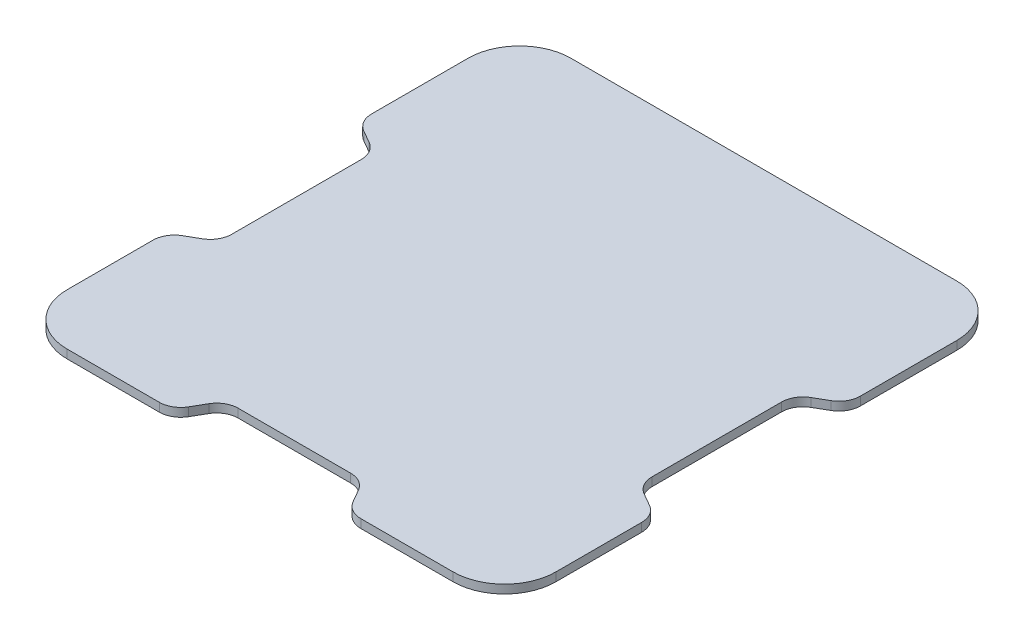
ISO-10303-21;
HEADER;
FILE_DESCRIPTION(('STEP AP214'),'2;1');
FILE_NAME('part.step','',(''),(''),'','','');
FILE_SCHEMA(('AUTOMOTIVE_DESIGN { 1 0 10303 214 1 1 1 1 }'));
ENDSEC;
DATA;
#1=APPLICATION_CONTEXT('core data for automotive mechanical design processes');
#2=APPLICATION_PROTOCOL_DEFINITION('international standard','automotive_design',2000,#1);
#3=PRODUCT_CONTEXT('',#1,'mechanical');
#4=PRODUCT('Part','Part','',(#3));
#5=PRODUCT_RELATED_PRODUCT_CATEGORY('part','',(#4));
#6=PRODUCT_DEFINITION_FORMATION('','',#4);
#7=PRODUCT_DEFINITION_CONTEXT('part definition',#1,'design');
#8=PRODUCT_DEFINITION('design','',#6,#7);
#9=PRODUCT_DEFINITION_SHAPE('','',#8);
#10=(LENGTH_UNIT() NAMED_UNIT(*) SI_UNIT(.MILLI.,.METRE.));
#11=(NAMED_UNIT(*) PLANE_ANGLE_UNIT() SI_UNIT($,.RADIAN.));
#12=(NAMED_UNIT(*) SI_UNIT($,.STERADIAN.) SOLID_ANGLE_UNIT());
#13=UNCERTAINTY_MEASURE_WITH_UNIT(LENGTH_MEASURE(1.E-05),#10,'distance_accuracy_value','');
#14=(GEOMETRIC_REPRESENTATION_CONTEXT(3) GLOBAL_UNCERTAINTY_ASSIGNED_CONTEXT((#13)) GLOBAL_UNIT_ASSIGNED_CONTEXT((#10,
#11,#12)) REPRESENTATION_CONTEXT('',''));
#15=CARTESIAN_POINT('',(0.,0.,0.));
#16=DIRECTION('',(0.,0.,1.));
#17=DIRECTION('',(1.,0.,0.));
#18=AXIS2_PLACEMENT_3D('',#15,#16,#17);
#19=CARTESIAN_POINT('',(57.,-2.,0.));
#20=DIRECTION('',(-1.,0.,0.));
#21=DIRECTION('',(0.,0.,1.));
#22=AXIS2_PLACEMENT_3D('',#19,#20,#21);
#23=PLANE('',#22);
#24=DIRECTION('',(0.,0.,1.));
#25=VECTOR('',#24,1.);
#26=CARTESIAN_POINT('',(57.,0.,0.));
#27=LINE('',#26,#25);
#28=CARTESIAN_POINT('',(57.,0.,-60.5));
#29=VERTEX_POINT('',#28);
#30=CARTESIAN_POINT('',(57.,0.,-38.0055534994651));
#31=VERTEX_POINT('',#30);
#32=EDGE_CURVE('E395',#29,#31,#27,.T.);
#33=ORIENTED_EDGE('',*,*,#32,.T.);
#34=DIRECTION('',(0.,1.,0.));
#35=VECTOR('',#34,1.);
#36=CARTESIAN_POINT('',(57.,-2.,-38.0055534994651));
#37=LINE('',#36,#35);
#38=CARTESIAN_POINT('',(57.,-2.,-38.0055534994651));
#39=VERTEX_POINT('',#38);
#40=EDGE_CURVE('E410',#31,#39,#37,.F.);
#41=ORIENTED_EDGE('',*,*,#40,.T.);
#42=DIRECTION('',(0.,0.,1.));
#43=VECTOR('',#42,1.);
#44=CARTESIAN_POINT('',(57.,-2.,0.));
#45=LINE('',#44,#43);
#46=CARTESIAN_POINT('',(57.,-2.,-60.5));
#47=VERTEX_POINT('',#46);
#48=EDGE_CURVE('E674',#47,#39,#45,.T.);
#49=ORIENTED_EDGE('',*,*,#48,.F.);
#50=DIRECTION('',(0.,1.,0.));
#51=VECTOR('',#50,1.);
#52=CARTESIAN_POINT('',(57.,0.,-60.5));
#53=LINE('',#52,#51);
#54=EDGE_CURVE('E341',#47,#29,#53,.T.);
#55=ORIENTED_EDGE('',*,*,#54,.T.);
#56=EDGE_LOOP('',(#33,#41,#49,#55));
#57=FACE_BOUND('',#56,.T.);
#58=ADVANCED_FACE('F41',(#57),#23,.F.);
#59=CARTESIAN_POINT('',(-0.956887407712731,-2.,-1.65737760728133));
#60=DIRECTION('',(-0.499999999999999,0.,-0.866025403784439));
#61=DIRECTION('',(-0.866025403784439,0.,0.499999999999999));
#62=AXIS2_PLACEMENT_3D('',#59,#60,#61);
#63=PLANE('',#62);
#64=DIRECTION('',(-0.866025403784439,0.,0.499999999999999));
#65=VECTOR('',#64,1.);
#66=CARTESIAN_POINT('',(-0.956887407712731,0.,-1.65737760728133));
#67=LINE('',#66,#65);
#68=CARTESIAN_POINT('',(54.5,0.,-33.6754264805429));
#69=VERTEX_POINT('',#68);
#70=CARTESIAN_POINT('',(51.5,0.,-31.9433756729741));
#71=VERTEX_POINT('',#70);
#72=EDGE_CURVE('E290',#69,#71,#67,.T.);
#73=ORIENTED_EDGE('',*,*,#72,.T.);
#74=DIRECTION('',(0.,1.,0.));
#75=VECTOR('',#74,1.);
#76=CARTESIAN_POINT('',(51.5,-2.,-31.9433756729741));
#77=LINE('',#76,#75);
#78=CARTESIAN_POINT('',(51.5,-2.,-31.9433756729741));
#79=VERTEX_POINT('',#78);
#80=EDGE_CURVE('E471',#71,#79,#77,.F.);
#81=ORIENTED_EDGE('',*,*,#80,.T.);
#82=DIRECTION('',(-0.866025403784439,0.,0.499999999999999));
#83=VECTOR('',#82,1.);
#84=CARTESIAN_POINT('',(-0.956887407712731,-2.,-1.65737760728133));
#85=LINE('',#84,#83);
#86=CARTESIAN_POINT('',(54.5,-2.,-33.6754264805429));
#87=VERTEX_POINT('',#86);
#88=EDGE_CURVE('E281',#87,#79,#85,.T.);
#89=ORIENTED_EDGE('',*,*,#88,.F.);
#90=DIRECTION('',(0.,1.,0.));
#91=VECTOR('',#90,1.);
#92=CARTESIAN_POINT('',(54.5,-2.,-33.6754264805429));
#93=LINE('',#92,#91);
#94=EDGE_CURVE('E351',#87,#69,#93,.T.);
#95=ORIENTED_EDGE('',*,*,#94,.T.);
#96=EDGE_LOOP('',(#73,#81,#89,#95));
#97=FACE_BOUND('',#96,.T.);
#98=ADVANCED_FACE('F652',(#97),#63,.F.);
#99=CARTESIAN_POINT('',(49.,-2.,0.));
#100=DIRECTION('',(-1.,0.,0.));
#101=DIRECTION('',(0.,0.,1.));
#102=AXIS2_PLACEMENT_3D('',#99,#100,#101);
#103=PLANE('',#102);
#104=DIRECTION('',(0.,0.,1.));
#105=VECTOR('',#104,1.);
#106=CARTESIAN_POINT('',(49.,0.,0.));
#107=LINE('',#106,#105);
#108=CARTESIAN_POINT('',(49.,0.,-27.6132486540519));
#109=VERTEX_POINT('',#108);
#110=CARTESIAN_POINT('',(49.,0.,2.61324865405186));
#111=VERTEX_POINT('',#110);
#112=EDGE_CURVE('E574',#109,#111,#107,.T.);
#113=ORIENTED_EDGE('',*,*,#112,.T.);
#114=DIRECTION('',(0.,1.,0.));
#115=VECTOR('',#114,1.);
#116=CARTESIAN_POINT('',(49.,-2.,2.61324865405186));
#117=LINE('',#116,#115);
#118=CARTESIAN_POINT('',(49.,-2.,2.61324865405186));
#119=VERTEX_POINT('',#118);
#120=EDGE_CURVE('E469',#111,#119,#117,.F.);
#121=ORIENTED_EDGE('',*,*,#120,.T.);
#122=DIRECTION('',(0.,0.,1.));
#123=VECTOR('',#122,1.);
#124=CARTESIAN_POINT('',(49.,-2.,0.));
#125=LINE('',#124,#123);
#126=CARTESIAN_POINT('',(49.,-2.,-27.6132486540519));
#127=VERTEX_POINT('',#126);
#128=EDGE_CURVE('E287',#127,#119,#125,.T.);
#129=ORIENTED_EDGE('',*,*,#128,.F.);
#130=DIRECTION('',(0.,1.,0.));
#131=VECTOR('',#130,1.);
#132=CARTESIAN_POINT('',(49.,0.,-27.6132486540519));
#133=LINE('',#132,#131);
#134=EDGE_CURVE('E466',#127,#109,#133,.T.);
#135=ORIENTED_EDGE('',*,*,#134,.T.);
#136=EDGE_LOOP('',(#113,#121,#129,#135));
#137=FACE_BOUND('',#136,.T.);
#138=ADVANCED_FACE('F659',(#137),#103,.F.);
#139=CARTESIAN_POINT('',(9.86843013959274,-2.,-17.0926223927187));
#140=DIRECTION('',(-0.499999999999999,0.,0.866025403784439));
#141=DIRECTION('',(0.866025403784439,0.,0.499999999999999));
#142=AXIS2_PLACEMENT_3D('',#139,#140,#141);
#143=PLANE('',#142);
#144=DIRECTION('',(0.866025403784439,0.,0.499999999999999));
#145=VECTOR('',#144,1.);
#146=CARTESIAN_POINT('',(9.86843013959274,-2.,-17.0926223927187));
#147=LINE('',#146,#145);
#148=CARTESIAN_POINT('',(51.5,-2.,6.94337567297406));
#149=VERTEX_POINT('',#148);
#150=CARTESIAN_POINT('',(54.5,-2.,8.67542648054294));
#151=VERTEX_POINT('',#150);
#152=EDGE_CURVE('E550',#149,#151,#147,.T.);
#153=ORIENTED_EDGE('',*,*,#152,.F.);
#154=DIRECTION('',(0.,1.,0.));
#155=VECTOR('',#154,1.);
#156=CARTESIAN_POINT('',(51.5,0.,6.94337567297405));
#157=LINE('',#156,#155);
#158=CARTESIAN_POINT('',(51.5,0.,6.94337567297406));
#159=VERTEX_POINT('',#158);
#160=EDGE_CURVE('E463',#149,#159,#157,.T.);
#161=ORIENTED_EDGE('',*,*,#160,.T.);
#162=DIRECTION('',(0.866025403784439,0.,0.499999999999999));
#163=VECTOR('',#162,1.);
#164=CARTESIAN_POINT('',(9.86843013959274,0.,-17.0926223927187));
#165=LINE('',#164,#163);
#166=CARTESIAN_POINT('',(54.5,0.,8.67542648054294));
#167=VERTEX_POINT('',#166);
#168=EDGE_CURVE('E567',#159,#167,#165,.T.);
#169=ORIENTED_EDGE('',*,*,#168,.T.);
#170=DIRECTION('',(0.,1.,0.));
#171=VECTOR('',#170,1.);
#172=CARTESIAN_POINT('',(54.5,-2.,8.67542648054294));
#173=LINE('',#172,#171);
#174=EDGE_CURVE('E430',#167,#151,#173,.F.);
#175=ORIENTED_EDGE('',*,*,#174,.T.);
#176=EDGE_LOOP('',(#153,#161,#169,#175));
#177=FACE_BOUND('',#176,.T.);
#178=ADVANCED_FACE('F566',(#177),#143,.F.);
#179=CARTESIAN_POINT('',(57.,-2.,13.0055534994651));
#180=VERTEX_POINT('',#179);
#181=CARTESIAN_POINT('',(57.,-2.,33.));
#182=VERTEX_POINT('',#181);
#183=EDGE_CURVE('E549',#180,#182,#45,.T.);
#184=ORIENTED_EDGE('',*,*,#183,.F.);
#185=DIRECTION('',(0.,1.,0.));
#186=VECTOR('',#185,1.);
#187=CARTESIAN_POINT('',(57.,-2.,13.0055534994651));
#188=LINE('',#187,#186);
#189=CARTESIAN_POINT('',(57.,0.,13.0055534994651));
#190=VERTEX_POINT('',#189);
#191=EDGE_CURVE('E427',#180,#190,#188,.T.);
#192=ORIENTED_EDGE('',*,*,#191,.T.);
#193=CARTESIAN_POINT('',(57.,0.,33.));
#194=VERTEX_POINT('',#193);
#195=EDGE_CURVE('E399',#190,#194,#27,.T.);
#196=ORIENTED_EDGE('',*,*,#195,.T.);
#197=DIRECTION('',(0.,1.,0.));
#198=VECTOR('',#197,1.);
#199=CARTESIAN_POINT('',(57.,-2.,33.));
#200=LINE('',#199,#198);
#201=EDGE_CURVE('E338',#194,#182,#200,.F.);
#202=ORIENTED_EDGE('',*,*,#201,.T.);
#203=EDGE_LOOP('',(#184,#192,#196,#202));
#204=FACE_BOUND('',#203,.T.);
#205=ADVANCED_FACE('F655',(#204),#23,.F.);
#206=CARTESIAN_POINT('',(0.,-2.,45.));
#207=DIRECTION('',(0.,0.,-1.));
#208=DIRECTION('',(-1.,0.,0.));
#209=AXIS2_PLACEMENT_3D('',#206,#207,#208);
#210=PLANE('',#209);
#211=DIRECTION('',(-1.,0.,0.));
#212=VECTOR('',#211,1.);
#213=CARTESIAN_POINT('',(0.,0.,45.));
#214=LINE('',#213,#212);
#215=CARTESIAN_POINT('',(45.,0.,45.));
#216=VERTEX_POINT('',#215);
#217=CARTESIAN_POINT('',(23.5055534994651,0.,45.));
#218=VERTEX_POINT('',#217);
#219=EDGE_CURVE('E387',#216,#218,#214,.T.);
#220=ORIENTED_EDGE('',*,*,#219,.T.);
#221=DIRECTION('',(0.,1.,0.));
#222=VECTOR('',#221,1.);
#223=CARTESIAN_POINT('',(23.5055534994651,-2.,45.));
#224=LINE('',#223,#222);
#225=CARTESIAN_POINT('',(23.5055534994651,-2.,45.));
#226=VERTEX_POINT('',#225);
#227=EDGE_CURVE('E436',#218,#226,#224,.F.);
#228=ORIENTED_EDGE('',*,*,#227,.T.);
#229=DIRECTION('',(-1.,0.,0.));
#230=VECTOR('',#229,1.);
#231=CARTESIAN_POINT('',(0.,-2.,45.));
#232=LINE('',#231,#230);
#233=CARTESIAN_POINT('',(45.,-2.,45.));
#234=VERTEX_POINT('',#233);
#235=EDGE_CURVE('E546',#234,#226,#232,.T.);
#236=ORIENTED_EDGE('',*,*,#235,.F.);
#237=DIRECTION('',(0.,1.,0.));
#238=VECTOR('',#237,1.);
#239=CARTESIAN_POINT('',(45.,-2.,45.));
#240=LINE('',#239,#238);
#241=EDGE_CURVE('E335',#234,#216,#240,.T.);
#242=ORIENTED_EDGE('',*,*,#241,.T.);
#243=EDGE_LOOP('',(#220,#228,#236,#242));
#244=FACE_BOUND('',#243,.T.);
#245=ADVANCED_FACE('F589',(#244),#210,.F.);
#246=CARTESIAN_POINT('',(-4.02146997001203,-2.,2.32179676972443));
#247=DIRECTION('',(0.86602540378444,0.,-0.499999999999998));
#248=DIRECTION('',(-0.499999999999998,0.,-0.86602540378444));
#249=AXIS2_PLACEMENT_3D('',#246,#247,#248);
#250=PLANE('',#249);
#251=DIRECTION('',(-0.499999999999998,0.,-0.86602540378444));
#252=VECTOR('',#251,1.);
#253=CARTESIAN_POINT('',(-4.02146997001203,0.,2.32179676972443));
#254=LINE('',#253,#252);
#255=CARTESIAN_POINT('',(19.1754264805429,0.,42.5));
#256=VERTEX_POINT('',#255);
#257=CARTESIAN_POINT('',(17.4433756729741,0.,39.5));
#258=VERTEX_POINT('',#257);
#259=EDGE_CURVE('E382',#256,#258,#254,.T.);
#260=ORIENTED_EDGE('',*,*,#259,.T.);
#261=DIRECTION('',(0.,1.,0.));
#262=VECTOR('',#261,1.);
#263=CARTESIAN_POINT('',(17.4433756729741,-2.,39.5));
#264=LINE('',#263,#262);
#265=CARTESIAN_POINT('',(17.4433756729741,-2.,39.5));
#266=VERTEX_POINT('',#265);
#267=EDGE_CURVE('E461',#258,#266,#264,.F.);
#268=ORIENTED_EDGE('',*,*,#267,.T.);
#269=DIRECTION('',(-0.499999999999998,0.,-0.86602540378444));
#270=VECTOR('',#269,1.);
#271=CARTESIAN_POINT('',(-4.02146997001203,-2.,2.32179676972443));
#272=LINE('',#271,#270);
#273=CARTESIAN_POINT('',(19.1754264805429,-2.,42.5));
#274=VERTEX_POINT('',#273);
#275=EDGE_CURVE('E543',#274,#266,#272,.T.);
#276=ORIENTED_EDGE('',*,*,#275,.F.);
#277=DIRECTION('',(0.,1.,0.));
#278=VECTOR('',#277,1.);
#279=CARTESIAN_POINT('',(19.1754264805429,-2.,42.5));
#280=LINE('',#279,#278);
#281=EDGE_CURVE('E433',#274,#256,#280,.T.);
#282=ORIENTED_EDGE('',*,*,#281,.T.);
#283=EDGE_LOOP('',(#260,#268,#276,#282));
#284=FACE_BOUND('',#283,.T.);
#285=ADVANCED_FACE('F599',(#284),#250,.F.);
#286=CARTESIAN_POINT('',(0.,-2.,37.));
#287=DIRECTION('',(0.,0.,1.));
#288=DIRECTION('',(1.,0.,0.));
#289=AXIS2_PLACEMENT_3D('',#286,#287,#288);
#290=PLANE('',#289);
#291=DIRECTION('',(1.,0.,0.));
#292=VECTOR('',#291,1.);
#293=CARTESIAN_POINT('',(0.,0.,37.));
#294=LINE('',#293,#292);
#295=CARTESIAN_POINT('',(-13.1132486540519,0.,37.));
#296=VERTEX_POINT('',#295);
#297=CARTESIAN_POINT('',(13.1132486540519,0.,37.));
#298=VERTEX_POINT('',#297);
#299=EDGE_CURVE('E375',#296,#298,#294,.T.);
#300=ORIENTED_EDGE('',*,*,#299,.F.);
#301=DIRECTION('',(0.,1.,0.));
#302=VECTOR('',#301,1.);
#303=CARTESIAN_POINT('',(-13.1132486540519,-2.,37.));
#304=LINE('',#303,#302);
#305=CARTESIAN_POINT('',(-13.1132486540519,-2.,37.));
#306=VERTEX_POINT('',#305);
#307=EDGE_CURVE('E459',#296,#306,#304,.F.);
#308=ORIENTED_EDGE('',*,*,#307,.T.);
#309=DIRECTION('',(1.,0.,0.));
#310=VECTOR('',#309,1.);
#311=CARTESIAN_POINT('',(0.,-2.,37.));
#312=LINE('',#311,#310);
#313=CARTESIAN_POINT('',(13.1132486540519,-2.,37.));
#314=VERTEX_POINT('',#313);
#315=EDGE_CURVE('E540',#306,#314,#312,.T.);
#316=ORIENTED_EDGE('',*,*,#315,.T.);
#317=DIRECTION('',(0.,1.,0.));
#318=VECTOR('',#317,1.);
#319=CARTESIAN_POINT('',(13.1132486540519,-2.,37.));
#320=LINE('',#319,#318);
#321=EDGE_CURVE('E456',#314,#298,#320,.T.);
#322=ORIENTED_EDGE('',*,*,#321,.T.);
#323=EDGE_LOOP('',(#300,#308,#316,#322));
#324=FACE_BOUND('',#323,.T.);
#325=ADVANCED_FACE('F609',(#324),#290,.T.);
#326=CARTESIAN_POINT('',(4.02146997001203,-2.,2.32179676972443));
#327=DIRECTION('',(0.86602540378444,0.,0.499999999999998));
#328=DIRECTION('',(0.499999999999998,0.,-0.86602540378444));
#329=AXIS2_PLACEMENT_3D('',#326,#327,#328);
#330=PLANE('',#329);
#331=DIRECTION('',(0.499999999999998,0.,-0.86602540378444));
#332=VECTOR('',#331,1.);
#333=CARTESIAN_POINT('',(4.02146997001203,-2.,2.32179676972443));
#334=LINE('',#333,#332);
#335=CARTESIAN_POINT('',(-19.1754264805429,-2.,42.5));
#336=VERTEX_POINT('',#335);
#337=CARTESIAN_POINT('',(-17.4433756729741,-2.,39.5));
#338=VERTEX_POINT('',#337);
#339=EDGE_CURVE('E537',#336,#338,#334,.T.);
#340=ORIENTED_EDGE('',*,*,#339,.T.);
#341=DIRECTION('',(0.,1.,0.));
#342=VECTOR('',#341,1.);
#343=CARTESIAN_POINT('',(-17.4433756729741,0.,39.5));
#344=LINE('',#343,#342);
#345=CARTESIAN_POINT('',(-17.4433756729741,0.,39.5));
#346=VERTEX_POINT('',#345);
#347=EDGE_CURVE('E453',#338,#346,#344,.T.);
#348=ORIENTED_EDGE('',*,*,#347,.T.);
#349=DIRECTION('',(0.499999999999998,0.,-0.86602540378444));
#350=VECTOR('',#349,1.);
#351=CARTESIAN_POINT('',(4.02146997001203,0.,2.32179676972443));
#352=LINE('',#351,#350);
#353=CARTESIAN_POINT('',(-19.1754264805429,0.,42.5));
#354=VERTEX_POINT('',#353);
#355=EDGE_CURVE('E371',#354,#346,#352,.T.);
#356=ORIENTED_EDGE('',*,*,#355,.F.);
#357=DIRECTION('',(0.,1.,0.));
#358=VECTOR('',#357,1.);
#359=CARTESIAN_POINT('',(-19.1754264805429,-2.,42.5));
#360=LINE('',#359,#358);
#361=EDGE_CURVE('E441',#354,#336,#360,.F.);
#362=ORIENTED_EDGE('',*,*,#361,.T.);
#363=EDGE_LOOP('',(#340,#348,#356,#362));
#364=FACE_BOUND('',#363,.T.);
#365=ADVANCED_FACE('F617',(#364),#330,.T.);
#366=CARTESIAN_POINT('',(0.,-2.,45.));
#367=DIRECTION('',(0.,0.,1.));
#368=DIRECTION('',(1.,0.,0.));
#369=AXIS2_PLACEMENT_3D('',#366,#367,#368);
#370=PLANE('',#369);
#371=DIRECTION('',(1.,0.,0.));
#372=VECTOR('',#371,1.);
#373=CARTESIAN_POINT('',(0.,-2.,45.));
#374=LINE('',#373,#372);
#375=CARTESIAN_POINT('',(-45.,-2.,45.));
#376=VERTEX_POINT('',#375);
#377=CARTESIAN_POINT('',(-23.5055534994651,-2.,45.));
#378=VERTEX_POINT('',#377);
#379=EDGE_CURVE('E534',#376,#378,#374,.T.);
#380=ORIENTED_EDGE('',*,*,#379,.T.);
#381=DIRECTION('',(0.,1.,0.));
#382=VECTOR('',#381,1.);
#383=CARTESIAN_POINT('',(-23.5055534994651,-2.,45.));
#384=LINE('',#383,#382);
#385=CARTESIAN_POINT('',(-23.5055534994651,0.,45.));
#386=VERTEX_POINT('',#385);
#387=EDGE_CURVE('E438',#378,#386,#384,.T.);
#388=ORIENTED_EDGE('',*,*,#387,.T.);
#389=DIRECTION('',(1.,0.,0.));
#390=VECTOR('',#389,1.);
#391=CARTESIAN_POINT('',(0.,0.,45.));
#392=LINE('',#391,#390);
#393=CARTESIAN_POINT('',(-45.,0.,45.));
#394=VERTEX_POINT('',#393);
#395=EDGE_CURVE('E262',#394,#386,#392,.T.);
#396=ORIENTED_EDGE('',*,*,#395,.F.);
#397=DIRECTION('',(0.,1.,0.));
#398=VECTOR('',#397,1.);
#399=CARTESIAN_POINT('',(-45.,-2.,45.));
#400=LINE('',#399,#398);
#401=EDGE_CURVE('E272',#394,#376,#400,.F.);
#402=ORIENTED_EDGE('',*,*,#401,.T.);
#403=EDGE_LOOP('',(#380,#388,#396,#402));
#404=FACE_BOUND('',#403,.T.);
#405=ADVANCED_FACE('F625',(#404),#370,.T.);
#406=CARTESIAN_POINT('',(-57.,-2.,0.));
#407=DIRECTION('',(-1.,0.,0.));
#408=DIRECTION('',(0.,0.,1.));
#409=AXIS2_PLACEMENT_3D('',#406,#407,#408);
#410=PLANE('',#409);
#411=DIRECTION('',(0.,0.,1.));
#412=VECTOR('',#411,1.);
#413=CARTESIAN_POINT('',(-57.,0.,0.));
#414=LINE('',#413,#412);
#415=CARTESIAN_POINT('',(-57.,0.,13.0055534994651));
#416=VERTEX_POINT('',#415);
#417=CARTESIAN_POINT('',(-57.,0.,33.));
#418=VERTEX_POINT('',#417);
#419=EDGE_CURVE('E249',#416,#418,#414,.T.);
#420=ORIENTED_EDGE('',*,*,#419,.F.);
#421=DIRECTION('',(0.,1.,0.));
#422=VECTOR('',#421,1.);
#423=CARTESIAN_POINT('',(-57.,-2.,13.0055534994651));
#424=LINE('',#423,#422);
#425=CARTESIAN_POINT('',(-57.,-2.,13.0055534994651));
#426=VERTEX_POINT('',#425);
#427=EDGE_CURVE('E451',#416,#426,#424,.F.);
#428=ORIENTED_EDGE('',*,*,#427,.T.);
#429=DIRECTION('',(0.,0.,1.));
#430=VECTOR('',#429,1.);
#431=CARTESIAN_POINT('',(-57.,-2.,0.));
#432=LINE('',#431,#430);
#433=CARTESIAN_POINT('',(-57.,-2.,33.));
#434=VERTEX_POINT('',#433);
#435=EDGE_CURVE('E278',#426,#434,#432,.T.);
#436=ORIENTED_EDGE('',*,*,#435,.T.);
#437=DIRECTION('',(0.,1.,0.));
#438=VECTOR('',#437,1.);
#439=CARTESIAN_POINT('',(-57.,-2.,33.));
#440=LINE('',#439,#438);
#441=EDGE_CURVE('E271',#434,#418,#440,.T.);
#442=ORIENTED_EDGE('',*,*,#441,.T.);
#443=EDGE_LOOP('',(#420,#428,#436,#442));
#444=FACE_BOUND('',#443,.T.);
#445=ADVANCED_FACE('F276',(#444),#410,.T.);
#446=CARTESIAN_POINT('',(-9.86843013959274,-2.,-17.0926223927187));
#447=DIRECTION('',(-0.499999999999999,0.,-0.866025403784439));
#448=DIRECTION('',(-0.866025403784439,0.,0.499999999999999));
#449=AXIS2_PLACEMENT_3D('',#446,#447,#448);
#450=PLANE('',#449);
#451=DIRECTION('',(-0.866025403784439,0.,0.499999999999999));
#452=VECTOR('',#451,1.);
#453=CARTESIAN_POINT('',(-9.86843013959274,0.,-17.0926223927187));
#454=LINE('',#453,#452);
#455=CARTESIAN_POINT('',(-51.5,0.,6.94337567297406));
#456=VERTEX_POINT('',#455);
#457=CARTESIAN_POINT('',(-54.5,0.,8.67542648054293));
#458=VERTEX_POINT('',#457);
#459=EDGE_CURVE('E263',#456,#458,#454,.T.);
#460=ORIENTED_EDGE('',*,*,#459,.F.);
#461=DIRECTION('',(0.,1.,0.));
#462=VECTOR('',#461,1.);
#463=CARTESIAN_POINT('',(-51.5,-2.,6.94337567297405));
#464=LINE('',#463,#462);
#465=CARTESIAN_POINT('',(-51.5,-2.,6.94337567297406));
#466=VERTEX_POINT('',#465);
#467=EDGE_CURVE('E478',#456,#466,#464,.F.);
#468=ORIENTED_EDGE('',*,*,#467,.T.);
#469=DIRECTION('',(-0.866025403784439,0.,0.499999999999999));
#470=VECTOR('',#469,1.);
#471=CARTESIAN_POINT('',(-9.86843013959274,-2.,-17.0926223927187));
#472=LINE('',#471,#470);
#473=CARTESIAN_POINT('',(-54.5,-2.,8.67542648054293));
#474=VERTEX_POINT('',#473);
#475=EDGE_CURVE('E526',#466,#474,#472,.T.);
#476=ORIENTED_EDGE('',*,*,#475,.T.);
#477=DIRECTION('',(0.,1.,0.));
#478=VECTOR('',#477,1.);
#479=CARTESIAN_POINT('',(-54.5,-2.,8.67542648054293));
#480=LINE('',#479,#478);
#481=EDGE_CURVE('E448',#474,#458,#480,.T.);
#482=ORIENTED_EDGE('',*,*,#481,.T.);
#483=EDGE_LOOP('',(#460,#468,#476,#482));
#484=FACE_BOUND('',#483,.T.);
#485=ADVANCED_FACE('F638',(#484),#450,.T.);
#486=CARTESIAN_POINT('',(-49.,-2.,0.));
#487=DIRECTION('',(-1.,0.,0.));
#488=DIRECTION('',(0.,0.,1.));
#489=AXIS2_PLACEMENT_3D('',#486,#487,#488);
#490=PLANE('',#489);
#491=DIRECTION('',(0.,0.,1.));
#492=VECTOR('',#491,1.);
#493=CARTESIAN_POINT('',(-49.,-2.,0.));
#494=LINE('',#493,#492);
#495=CARTESIAN_POINT('',(-49.,-2.,-27.6132486540519));
#496=VERTEX_POINT('',#495);
#497=CARTESIAN_POINT('',(-49.,-2.,2.61324865405186));
#498=VERTEX_POINT('',#497);
#499=EDGE_CURVE('E523',#496,#498,#494,.T.);
#500=ORIENTED_EDGE('',*,*,#499,.T.);
#501=DIRECTION('',(0.,1.,0.));
#502=VECTOR('',#501,1.);
#503=CARTESIAN_POINT('',(-49.,0.,2.61324865405186));
#504=LINE('',#503,#502);
#505=CARTESIAN_POINT('',(-49.,0.,2.61324865405186));
#506=VERTEX_POINT('',#505);
#507=EDGE_CURVE('E475',#498,#506,#504,.T.);
#508=ORIENTED_EDGE('',*,*,#507,.T.);
#509=DIRECTION('',(0.,0.,1.));
#510=VECTOR('',#509,1.);
#511=CARTESIAN_POINT('',(-49.,0.,0.));
#512=LINE('',#511,#510);
#513=CARTESIAN_POINT('',(-49.,0.,-27.6132486540519));
#514=VERTEX_POINT('',#513);
#515=EDGE_CURVE('E512',#514,#506,#512,.T.);
#516=ORIENTED_EDGE('',*,*,#515,.F.);
#517=DIRECTION('',(0.,1.,0.));
#518=VECTOR('',#517,1.);
#519=CARTESIAN_POINT('',(-49.,-2.,-27.6132486540519));
#520=LINE('',#519,#518);
#521=EDGE_CURVE('E473',#514,#496,#520,.F.);
#522=ORIENTED_EDGE('',*,*,#521,.T.);
#523=EDGE_LOOP('',(#500,#508,#516,#522));
#524=FACE_BOUND('',#523,.T.);
#525=ADVANCED_FACE('F516',(#524),#490,.T.);
#526=CARTESIAN_POINT('',(0.956887407712731,-2.,-1.65737760728133));
#527=DIRECTION('',(-0.499999999999999,0.,0.866025403784439));
#528=DIRECTION('',(0.866025403784439,0.,0.499999999999999));
#529=AXIS2_PLACEMENT_3D('',#526,#527,#528);
#530=PLANE('',#529);
#531=DIRECTION('',(0.866025403784439,0.,0.499999999999999));
#532=VECTOR('',#531,1.);
#533=CARTESIAN_POINT('',(0.956887407712731,-2.,-1.65737760728133));
#534=LINE('',#533,#532);
#535=CARTESIAN_POINT('',(-54.5,-2.,-33.6754264805429));
#536=VERTEX_POINT('',#535);
#537=CARTESIAN_POINT('',(-51.5,-2.,-31.9433756729741));
#538=VERTEX_POINT('',#537);
#539=EDGE_CURVE('E521',#536,#538,#534,.T.);
#540=ORIENTED_EDGE('',*,*,#539,.T.);
#541=DIRECTION('',(0.,1.,0.));
#542=VECTOR('',#541,1.);
#543=CARTESIAN_POINT('',(-51.5,0.,-31.9433756729741));
#544=LINE('',#543,#542);
#545=CARTESIAN_POINT('',(-51.5,0.,-31.9433756729741));
#546=VERTEX_POINT('',#545);
#547=EDGE_CURVE('E480',#538,#546,#544,.T.);
#548=ORIENTED_EDGE('',*,*,#547,.T.);
#549=DIRECTION('',(0.866025403784439,0.,0.499999999999999));
#550=VECTOR('',#549,1.);
#551=CARTESIAN_POINT('',(0.956887407712731,0.,-1.65737760728133));
#552=LINE('',#551,#550);
#553=CARTESIAN_POINT('',(-54.5,0.,-33.6754264805429));
#554=VERTEX_POINT('',#553);
#555=EDGE_CURVE('E308',#554,#546,#552,.T.);
#556=ORIENTED_EDGE('',*,*,#555,.F.);
#557=DIRECTION('',(0.,1.,0.));
#558=VECTOR('',#557,1.);
#559=CARTESIAN_POINT('',(-54.5,-2.,-33.6754264805429));
#560=LINE('',#559,#558);
#561=EDGE_CURVE('E446',#554,#536,#560,.F.);
#562=ORIENTED_EDGE('',*,*,#561,.T.);
#563=EDGE_LOOP('',(#540,#548,#556,#562));
#564=FACE_BOUND('',#563,.T.);
#565=ADVANCED_FACE('F519',(#564),#530,.T.);
#566=CARTESIAN_POINT('',(-57.,-2.,-60.5));
#567=VERTEX_POINT('',#566);
#568=CARTESIAN_POINT('',(-57.,-2.,-38.0055534994651));
#569=VERTEX_POINT('',#568);
#570=EDGE_CURVE('E524',#567,#569,#432,.T.);
#571=ORIENTED_EDGE('',*,*,#570,.T.);
#572=DIRECTION('',(0.,1.,0.));
#573=VECTOR('',#572,1.);
#574=CARTESIAN_POINT('',(-57.,-2.,-38.0055534994651));
#575=LINE('',#574,#573);
#576=CARTESIAN_POINT('',(-57.,0.,-38.0055534994651));
#577=VERTEX_POINT('',#576);
#578=EDGE_CURVE('E443',#569,#577,#575,.T.);
#579=ORIENTED_EDGE('',*,*,#578,.T.);
#580=CARTESIAN_POINT('',(-57.,0.,-60.5));
#581=VERTEX_POINT('',#580);
#582=EDGE_CURVE('E265',#581,#577,#414,.T.);
#583=ORIENTED_EDGE('',*,*,#582,.F.);
#584=DIRECTION('',(0.,1.,0.));
#585=VECTOR('',#584,1.);
#586=CARTESIAN_POINT('',(-57.,-2.,-60.5));
#587=LINE('',#586,#585);
#588=EDGE_CURVE('E349',#581,#567,#587,.F.);
#589=ORIENTED_EDGE('',*,*,#588,.T.);
#590=EDGE_LOOP('',(#571,#579,#583,#589));
#591=FACE_BOUND('',#590,.T.);
#592=ADVANCED_FACE('F822',(#591),#410,.T.);
#593=CARTESIAN_POINT('',(0.,-2.,-72.5));
#594=DIRECTION('',(0.,0.,-1.));
#595=DIRECTION('',(-1.,0.,0.));
#596=AXIS2_PLACEMENT_3D('',#593,#594,#595);
#597=PLANE('',#596);
#598=DIRECTION('',(-1.,0.,0.));
#599=VECTOR('',#598,1.);
#600=CARTESIAN_POINT('',(0.,0.,-72.5));
#601=LINE('',#600,#599);
#602=CARTESIAN_POINT('',(45.,0.,-72.5));
#603=VERTEX_POINT('',#602);
#604=CARTESIAN_POINT('',(-45.,0.,-72.5));
#605=VERTEX_POINT('',#604);
#606=EDGE_CURVE('E309',#603,#605,#601,.T.);
#607=ORIENTED_EDGE('',*,*,#606,.F.);
#608=DIRECTION('',(0.,1.,0.));
#609=VECTOR('',#608,1.);
#610=CARTESIAN_POINT('',(45.,-2.,-72.5));
#611=LINE('',#610,#609);
#612=CARTESIAN_POINT('',(45.,-2.,-72.5));
#613=VERTEX_POINT('',#612);
#614=EDGE_CURVE('E347',#603,#613,#611,.F.);
#615=ORIENTED_EDGE('',*,*,#614,.T.);
#616=DIRECTION('',(-1.,0.,0.));
#617=VECTOR('',#616,1.);
#618=CARTESIAN_POINT('',(0.,-2.,-72.5));
#619=LINE('',#618,#617);
#620=CARTESIAN_POINT('',(-45.,-2.,-72.5));
#621=VERTEX_POINT('',#620);
#622=EDGE_CURVE('E529',#613,#621,#619,.T.);
#623=ORIENTED_EDGE('',*,*,#622,.T.);
#624=DIRECTION('',(0.,1.,0.));
#625=VECTOR('',#624,1.);
#626=CARTESIAN_POINT('',(-45.,-2.,-72.5));
#627=LINE('',#626,#625);
#628=EDGE_CURVE('E344',#621,#605,#627,.T.);
#629=ORIENTED_EDGE('',*,*,#628,.T.);
#630=EDGE_LOOP('',(#607,#615,#623,#629));
#631=FACE_BOUND('',#630,.T.);
#632=ADVANCED_FACE('F814',(#631),#597,.T.);
#633=CARTESIAN_POINT('',(0.,-2.,0.));
#634=DIRECTION('',(0.,1.,0.));
#635=DIRECTION('',(0.,0.,1.));
#636=AXIS2_PLACEMENT_3D('',#633,#634,#635);
#637=PLANE('',#636);
#638=ORIENTED_EDGE('',*,*,#48,.T.);
#639=CARTESIAN_POINT('',(52.,-2.,-38.0055534994651));
#640=DIRECTION('',(0.,1.,0.));
#641=DIRECTION('',(0.,0.,1.));
#642=AXIS2_PLACEMENT_3D('',#639,#640,#641);
#643=CIRCLE('',#642,5.);
#644=EDGE_CURVE('E425',#39,#87,#643,.F.);
#645=ORIENTED_EDGE('',*,*,#644,.T.);
#646=ORIENTED_EDGE('',*,*,#88,.T.);
#647=CARTESIAN_POINT('',(54.,-2.,-27.6132486540519));
#648=DIRECTION('',(0.,1.,0.));
#649=DIRECTION('',(0.,0.,1.));
#650=AXIS2_PLACEMENT_3D('',#647,#648,#649);
#651=CIRCLE('',#650,5.);
#652=EDGE_CURVE('E500',#79,#127,#651,.T.);
#653=ORIENTED_EDGE('',*,*,#652,.T.);
#654=ORIENTED_EDGE('',*,*,#128,.T.);
#655=CARTESIAN_POINT('',(54.,-2.,2.61324865405186));
#656=DIRECTION('',(0.,1.,0.));
#657=DIRECTION('',(0.,0.,1.));
#658=AXIS2_PLACEMENT_3D('',#655,#656,#657);
#659=CIRCLE('',#658,5.);
#660=EDGE_CURVE('E495',#119,#149,#659,.T.);
#661=ORIENTED_EDGE('',*,*,#660,.T.);
#662=ORIENTED_EDGE('',*,*,#152,.T.);
#663=CARTESIAN_POINT('',(52.,-2.,13.0055534994651));
#664=DIRECTION('',(0.,1.,0.));
#665=DIRECTION('',(0.,0.,1.));
#666=AXIS2_PLACEMENT_3D('',#663,#664,#665);
#667=CIRCLE('',#666,5.);
#668=EDGE_CURVE('E423',#151,#180,#667,.F.);
#669=ORIENTED_EDGE('',*,*,#668,.T.);
#670=ORIENTED_EDGE('',*,*,#183,.T.);
#671=CARTESIAN_POINT('',(45.,-2.,33.));
#672=DIRECTION('',(0.,1.,0.));
#673=DIRECTION('',(0.,0.,1.));
#674=AXIS2_PLACEMENT_3D('',#671,#672,#673);
#675=CIRCLE('',#674,12.);
#676=EDGE_CURVE('E331',#182,#234,#675,.F.);
#677=ORIENTED_EDGE('',*,*,#676,.T.);
#678=ORIENTED_EDGE('',*,*,#235,.T.);
#679=CARTESIAN_POINT('',(23.5055534994651,-2.,40.));
#680=DIRECTION('',(0.,1.,0.));
#681=DIRECTION('',(0.,0.,1.));
#682=AXIS2_PLACEMENT_3D('',#679,#680,#681);
#683=CIRCLE('',#682,5.);
#684=EDGE_CURVE('E421',#226,#274,#683,.F.);
#685=ORIENTED_EDGE('',*,*,#684,.T.);
#686=ORIENTED_EDGE('',*,*,#275,.T.);
#687=CARTESIAN_POINT('',(13.1132486540519,-2.,42.));
#688=DIRECTION('',(0.,1.,0.));
#689=DIRECTION('',(0.,0.,1.));
#690=AXIS2_PLACEMENT_3D('',#687,#688,#689);
#691=CIRCLE('',#690,5.);
#692=EDGE_CURVE('E490',#266,#314,#691,.T.);
#693=ORIENTED_EDGE('',*,*,#692,.T.);
#694=ORIENTED_EDGE('',*,*,#315,.F.);
#695=CARTESIAN_POINT('',(-13.1132486540519,-2.,42.));
#696=DIRECTION('',(0.,1.,0.));
#697=DIRECTION('',(0.,0.,1.));
#698=AXIS2_PLACEMENT_3D('',#695,#696,#697);
#699=CIRCLE('',#698,5.);
#700=EDGE_CURVE('E485',#306,#338,#699,.T.);
#701=ORIENTED_EDGE('',*,*,#700,.T.);
#702=ORIENTED_EDGE('',*,*,#339,.F.);
#703=CARTESIAN_POINT('',(-23.5055534994651,-2.,40.));
#704=DIRECTION('',(0.,1.,0.));
#705=DIRECTION('',(0.,0.,1.));
#706=AXIS2_PLACEMENT_3D('',#703,#704,#705);
#707=CIRCLE('',#706,5.);
#708=EDGE_CURVE('E419',#336,#378,#707,.F.);
#709=ORIENTED_EDGE('',*,*,#708,.T.);
#710=ORIENTED_EDGE('',*,*,#379,.F.);
#711=CARTESIAN_POINT('',(-45.,-2.,33.));
#712=DIRECTION('',(0.,1.,0.));
#713=DIRECTION('',(0.,0.,1.));
#714=AXIS2_PLACEMENT_3D('',#711,#712,#713);
#715=CIRCLE('',#714,12.);
#716=EDGE_CURVE('E333',#376,#434,#715,.F.);
#717=ORIENTED_EDGE('',*,*,#716,.T.);
#718=ORIENTED_EDGE('',*,*,#435,.F.);
#719=CARTESIAN_POINT('',(-52.,-2.,13.0055534994651));
#720=DIRECTION('',(0.,1.,0.));
#721=DIRECTION('',(0.,0.,1.));
#722=AXIS2_PLACEMENT_3D('',#719,#720,#721);
#723=CIRCLE('',#722,5.);
#724=EDGE_CURVE('E414',#426,#474,#723,.F.);
#725=ORIENTED_EDGE('',*,*,#724,.T.);
#726=ORIENTED_EDGE('',*,*,#475,.F.);
#727=CARTESIAN_POINT('',(-54.,-2.,2.61324865405186));
#728=DIRECTION('',(0.,1.,0.));
#729=DIRECTION('',(0.,0.,1.));
#730=AXIS2_PLACEMENT_3D('',#727,#728,#729);
#731=CIRCLE('',#730,5.);
#732=EDGE_CURVE('E505',#466,#498,#731,.T.);
#733=ORIENTED_EDGE('',*,*,#732,.T.);
#734=ORIENTED_EDGE('',*,*,#499,.F.);
#735=CARTESIAN_POINT('',(-54.,-2.,-27.6132486540519));
#736=DIRECTION('',(0.,1.,0.));
#737=DIRECTION('',(0.,0.,1.));
#738=AXIS2_PLACEMENT_3D('',#735,#736,#737);
#739=CIRCLE('',#738,5.);
#740=EDGE_CURVE('E12',#496,#538,#739,.T.);
#741=ORIENTED_EDGE('',*,*,#740,.T.);
#742=ORIENTED_EDGE('',*,*,#539,.F.);
#743=CARTESIAN_POINT('',(-52.,-2.,-38.0055534994651));
#744=DIRECTION('',(0.,1.,0.));
#745=DIRECTION('',(0.,0.,1.));
#746=AXIS2_PLACEMENT_3D('',#743,#744,#745);
#747=CIRCLE('',#746,5.);
#748=EDGE_CURVE('E417',#536,#569,#747,.F.);
#749=ORIENTED_EDGE('',*,*,#748,.T.);
#750=ORIENTED_EDGE('',*,*,#570,.F.);
#751=CARTESIAN_POINT('',(-45.,-2.,-60.5));
#752=DIRECTION('',(0.,1.,0.));
#753=DIRECTION('',(0.,0.,1.));
#754=AXIS2_PLACEMENT_3D('',#751,#752,#753);
#755=CIRCLE('',#754,12.);
#756=EDGE_CURVE('E327',#567,#621,#755,.F.);
#757=ORIENTED_EDGE('',*,*,#756,.T.);
#758=ORIENTED_EDGE('',*,*,#622,.F.);
#759=CARTESIAN_POINT('',(45.,-2.,-60.5));
#760=DIRECTION('',(0.,1.,0.));
#761=DIRECTION('',(0.,0.,1.));
#762=AXIS2_PLACEMENT_3D('',#759,#760,#761);
#763=CIRCLE('',#762,12.);
#764=EDGE_CURVE('E329',#613,#47,#763,.F.);
#765=ORIENTED_EDGE('',*,*,#764,.T.);
#766=EDGE_LOOP('',(#638,#645,#646,#653,#654,#661,#662,#669,#670,#677,#678,#685,#686,#693,#694,
#701,#702,#709,#710,#717,#718,#725,#726,#733,#734,#741,#742,#749,#750,#757,#758,#765));
#767=FACE_BOUND('',#766,.T.);
#768=ADVANCED_FACE('F555',(#767),#637,.F.);
#769=CARTESIAN_POINT('',(0.,0.,0.));
#770=DIRECTION('',(0.,1.,0.));
#771=DIRECTION('',(0.,0.,1.));
#772=AXIS2_PLACEMENT_3D('',#769,#770,#771);
#773=PLANE('',#772);
#774=ORIENTED_EDGE('',*,*,#72,.F.);
#775=CARTESIAN_POINT('',(52.,0.,-38.0055534994651));
#776=DIRECTION('',(0.,1.,0.));
#777=DIRECTION('',(0.,0.,1.));
#778=AXIS2_PLACEMENT_3D('',#775,#776,#777);
#779=CIRCLE('',#778,5.);
#780=EDGE_CURVE('E406',#69,#31,#779,.T.);
#781=ORIENTED_EDGE('',*,*,#780,.T.);
#782=ORIENTED_EDGE('',*,*,#32,.F.);
#783=CARTESIAN_POINT('',(45.,0.,-60.5));
#784=DIRECTION('',(0.,1.,0.));
#785=DIRECTION('',(0.,0.,1.));
#786=AXIS2_PLACEMENT_3D('',#783,#784,#785);
#787=CIRCLE('',#786,12.);
#788=EDGE_CURVE('E284',#29,#603,#787,.T.);
#789=ORIENTED_EDGE('',*,*,#788,.T.);
#790=ORIENTED_EDGE('',*,*,#606,.T.);
#791=CARTESIAN_POINT('',(-45.,0.,-60.5));
#792=DIRECTION('',(0.,1.,0.));
#793=DIRECTION('',(0.,0.,1.));
#794=AXIS2_PLACEMENT_3D('',#791,#792,#793);
#795=CIRCLE('',#794,12.);
#796=EDGE_CURVE('E280',#605,#581,#795,.T.);
#797=ORIENTED_EDGE('',*,*,#796,.T.);
#798=ORIENTED_EDGE('',*,*,#582,.T.);
#799=CARTESIAN_POINT('',(-52.,0.,-38.0055534994651));
#800=DIRECTION('',(0.,1.,0.));
#801=DIRECTION('',(0.,0.,1.));
#802=AXIS2_PLACEMENT_3D('',#799,#800,#801);
#803=CIRCLE('',#802,5.);
#804=EDGE_CURVE('E355',#577,#554,#803,.T.);
#805=ORIENTED_EDGE('',*,*,#804,.T.);
#806=ORIENTED_EDGE('',*,*,#555,.T.);
#807=CARTESIAN_POINT('',(-54.,0.,-27.6132486540519));
#808=DIRECTION('',(0.,1.,0.));
#809=DIRECTION('',(0.,0.,1.));
#810=AXIS2_PLACEMENT_3D('',#807,#808,#809);
#811=CIRCLE('',#810,5.);
#812=EDGE_CURVE('E49',#546,#514,#811,.F.);
#813=ORIENTED_EDGE('',*,*,#812,.T.);
#814=ORIENTED_EDGE('',*,*,#515,.T.);
#815=CARTESIAN_POINT('',(-54.,0.,2.61324865405186));
#816=DIRECTION('',(0.,1.,0.));
#817=DIRECTION('',(0.,0.,1.));
#818=AXIS2_PLACEMENT_3D('',#815,#816,#817);
#819=CIRCLE('',#818,5.);
#820=EDGE_CURVE('E502',#506,#456,#819,.F.);
#821=ORIENTED_EDGE('',*,*,#820,.T.);
#822=ORIENTED_EDGE('',*,*,#459,.T.);
#823=CARTESIAN_POINT('',(-52.,0.,13.0055534994651));
#824=DIRECTION('',(0.,1.,0.));
#825=DIRECTION('',(0.,0.,1.));
#826=AXIS2_PLACEMENT_3D('',#823,#824,#825);
#827=CIRCLE('',#826,5.);
#828=EDGE_CURVE('E257',#458,#416,#827,.T.);
#829=ORIENTED_EDGE('',*,*,#828,.T.);
#830=ORIENTED_EDGE('',*,*,#419,.T.);
#831=CARTESIAN_POINT('',(-45.,0.,33.));
#832=DIRECTION('',(0.,1.,0.));
#833=DIRECTION('',(0.,0.,1.));
#834=AXIS2_PLACEMENT_3D('',#831,#832,#833);
#835=CIRCLE('',#834,12.);
#836=EDGE_CURVE('E254',#418,#394,#835,.T.);
#837=ORIENTED_EDGE('',*,*,#836,.T.);
#838=ORIENTED_EDGE('',*,*,#395,.T.);
#839=CARTESIAN_POINT('',(-23.5055534994651,0.,40.));
#840=DIRECTION('',(0.,1.,0.));
#841=DIRECTION('',(0.,0.,1.));
#842=AXIS2_PLACEMENT_3D('',#839,#840,#841);
#843=CIRCLE('',#842,5.);
#844=EDGE_CURVE('E359',#386,#354,#843,.T.);
#845=ORIENTED_EDGE('',*,*,#844,.T.);
#846=ORIENTED_EDGE('',*,*,#355,.T.);
#847=CARTESIAN_POINT('',(-13.1132486540519,0.,42.));
#848=DIRECTION('',(0.,1.,0.));
#849=DIRECTION('',(0.,0.,1.));
#850=AXIS2_PLACEMENT_3D('',#847,#848,#849);
#851=CIRCLE('',#850,5.);
#852=EDGE_CURVE('E482',#346,#296,#851,.F.);
#853=ORIENTED_EDGE('',*,*,#852,.T.);
#854=ORIENTED_EDGE('',*,*,#299,.T.);
#855=CARTESIAN_POINT('',(13.1132486540519,0.,42.));
#856=DIRECTION('',(0.,1.,0.));
#857=DIRECTION('',(0.,0.,1.));
#858=AXIS2_PLACEMENT_3D('',#855,#856,#857);
#859=CIRCLE('',#858,5.);
#860=EDGE_CURVE('E487',#298,#258,#859,.F.);
#861=ORIENTED_EDGE('',*,*,#860,.T.);
#862=ORIENTED_EDGE('',*,*,#259,.F.);
#863=CARTESIAN_POINT('',(23.5055534994651,0.,40.));
#864=DIRECTION('',(0.,1.,0.));
#865=DIRECTION('',(0.,0.,1.));
#866=AXIS2_PLACEMENT_3D('',#863,#864,#865);
#867=CIRCLE('',#866,5.);
#868=EDGE_CURVE('E363',#256,#218,#867,.T.);
#869=ORIENTED_EDGE('',*,*,#868,.T.);
#870=ORIENTED_EDGE('',*,*,#219,.F.);
#871=CARTESIAN_POINT('',(45.,0.,33.));
#872=DIRECTION('',(0.,1.,0.));
#873=DIRECTION('',(0.,0.,1.));
#874=AXIS2_PLACEMENT_3D('',#871,#872,#873);
#875=CIRCLE('',#874,12.);
#876=EDGE_CURVE('E274',#216,#194,#875,.T.);
#877=ORIENTED_EDGE('',*,*,#876,.T.);
#878=ORIENTED_EDGE('',*,*,#195,.F.);
#879=CARTESIAN_POINT('',(52.,0.,13.0055534994651));
#880=DIRECTION('',(0.,1.,0.));
#881=DIRECTION('',(0.,0.,1.));
#882=AXIS2_PLACEMENT_3D('',#879,#880,#881);
#883=CIRCLE('',#882,5.);
#884=EDGE_CURVE('E411',#190,#167,#883,.T.);
#885=ORIENTED_EDGE('',*,*,#884,.T.);
#886=ORIENTED_EDGE('',*,*,#168,.F.);
#887=CARTESIAN_POINT('',(54.,0.,2.61324865405186));
#888=DIRECTION('',(0.,1.,0.));
#889=DIRECTION('',(0.,0.,1.));
#890=AXIS2_PLACEMENT_3D('',#887,#888,#889);
#891=CIRCLE('',#890,5.);
#892=EDGE_CURVE('E492',#159,#111,#891,.F.);
#893=ORIENTED_EDGE('',*,*,#892,.T.);
#894=ORIENTED_EDGE('',*,*,#112,.F.);
#895=CARTESIAN_POINT('',(54.,0.,-27.6132486540519));
#896=DIRECTION('',(0.,1.,0.));
#897=DIRECTION('',(0.,0.,1.));
#898=AXIS2_PLACEMENT_3D('',#895,#896,#897);
#899=CIRCLE('',#898,5.);
#900=EDGE_CURVE('E497',#109,#71,#899,.F.);
#901=ORIENTED_EDGE('',*,*,#900,.T.);
#902=EDGE_LOOP('',(#774,#781,#782,#789,#790,#797,#798,#805,#806,#813,#814,#821,#822,#829,#830,
#837,#838,#845,#846,#853,#854,#861,#862,#869,#870,#877,#878,#885,#886,#893,#894,#901));
#903=FACE_BOUND('',#902,.T.);
#904=ADVANCED_FACE('F252',(#903),#773,.T.);
#905=CARTESIAN_POINT('',(-45.,-2.,33.));
#906=DIRECTION('',(0.,1.,0.));
#907=DIRECTION('',(0.,0.,1.));
#908=AXIS2_PLACEMENT_3D('',#905,#906,#907);
#909=CYLINDRICAL_SURFACE('',#908,12.);
#910=ORIENTED_EDGE('',*,*,#716,.F.);
#911=ORIENTED_EDGE('',*,*,#401,.F.);
#912=ORIENTED_EDGE('',*,*,#836,.F.);
#913=ORIENTED_EDGE('',*,*,#441,.F.);
#914=EDGE_LOOP('',(#910,#911,#912,#913));
#915=FACE_BOUND('',#914,.T.);
#916=ADVANCED_FACE('F270',(#915),#909,.T.);
#917=CARTESIAN_POINT('',(45.,-2.,33.));
#918=DIRECTION('',(0.,1.,0.));
#919=DIRECTION('',(0.,0.,1.));
#920=AXIS2_PLACEMENT_3D('',#917,#918,#919);
#921=CYLINDRICAL_SURFACE('',#920,12.);
#922=ORIENTED_EDGE('',*,*,#676,.F.);
#923=ORIENTED_EDGE('',*,*,#201,.F.);
#924=ORIENTED_EDGE('',*,*,#876,.F.);
#925=ORIENTED_EDGE('',*,*,#241,.F.);
#926=EDGE_LOOP('',(#922,#923,#924,#925));
#927=FACE_BOUND('',#926,.T.);
#928=ADVANCED_FACE('F783',(#927),#921,.T.);
#929=CARTESIAN_POINT('',(45.,-2.,-60.5));
#930=DIRECTION('',(0.,-1.,0.));
#931=DIRECTION('',(0.,0.,-1.));
#932=AXIS2_PLACEMENT_3D('',#929,#930,#931);
#933=CYLINDRICAL_SURFACE('',#932,12.);
#934=ORIENTED_EDGE('',*,*,#764,.F.);
#935=ORIENTED_EDGE('',*,*,#614,.F.);
#936=ORIENTED_EDGE('',*,*,#788,.F.);
#937=ORIENTED_EDGE('',*,*,#54,.F.);
#938=EDGE_LOOP('',(#934,#935,#936,#937));
#939=FACE_BOUND('',#938,.T.);
#940=ADVANCED_FACE('F775',(#939),#933,.T.);
#941=CARTESIAN_POINT('',(-45.,-2.,-60.5));
#942=DIRECTION('',(0.,1.,0.));
#943=DIRECTION('',(0.,0.,1.));
#944=AXIS2_PLACEMENT_3D('',#941,#942,#943);
#945=CYLINDRICAL_SURFACE('',#944,12.);
#946=ORIENTED_EDGE('',*,*,#756,.F.);
#947=ORIENTED_EDGE('',*,*,#588,.F.);
#948=ORIENTED_EDGE('',*,*,#796,.F.);
#949=ORIENTED_EDGE('',*,*,#628,.F.);
#950=EDGE_LOOP('',(#946,#947,#948,#949));
#951=FACE_BOUND('',#950,.T.);
#952=ADVANCED_FACE('F686',(#951),#945,.T.);
#953=CARTESIAN_POINT('',(52.,-2.,-38.0055534994651));
#954=DIRECTION('',(0.,1.,0.));
#955=DIRECTION('',(0.,0.,1.));
#956=AXIS2_PLACEMENT_3D('',#953,#954,#955);
#957=CYLINDRICAL_SURFACE('',#956,5.);
#958=ORIENTED_EDGE('',*,*,#644,.F.);
#959=ORIENTED_EDGE('',*,*,#40,.F.);
#960=ORIENTED_EDGE('',*,*,#780,.F.);
#961=ORIENTED_EDGE('',*,*,#94,.F.);
#962=EDGE_LOOP('',(#958,#959,#960,#961));
#963=FACE_BOUND('',#962,.T.);
#964=ADVANCED_FACE('F679',(#963),#957,.T.);
#965=CARTESIAN_POINT('',(52.,-2.,13.0055534994651));
#966=DIRECTION('',(0.,1.,0.));
#967=DIRECTION('',(0.,0.,1.));
#968=AXIS2_PLACEMENT_3D('',#965,#966,#967);
#969=CYLINDRICAL_SURFACE('',#968,5.);
#970=ORIENTED_EDGE('',*,*,#668,.F.);
#971=ORIENTED_EDGE('',*,*,#174,.F.);
#972=ORIENTED_EDGE('',*,*,#884,.F.);
#973=ORIENTED_EDGE('',*,*,#191,.F.);
#974=EDGE_LOOP('',(#970,#971,#972,#973));
#975=FACE_BOUND('',#974,.T.);
#976=ADVANCED_FACE('F677',(#975),#969,.T.);
#977=CARTESIAN_POINT('',(23.5055534994651,-2.,40.));
#978=DIRECTION('',(0.,1.,0.));
#979=DIRECTION('',(0.,0.,1.));
#980=AXIS2_PLACEMENT_3D('',#977,#978,#979);
#981=CYLINDRICAL_SURFACE('',#980,5.);
#982=ORIENTED_EDGE('',*,*,#684,.F.);
#983=ORIENTED_EDGE('',*,*,#227,.F.);
#984=ORIENTED_EDGE('',*,*,#868,.F.);
#985=ORIENTED_EDGE('',*,*,#281,.F.);
#986=EDGE_LOOP('',(#982,#983,#984,#985));
#987=FACE_BOUND('',#986,.T.);
#988=ADVANCED_FACE('F594',(#987),#981,.T.);
#989=CARTESIAN_POINT('',(-23.5055534994651,-2.,40.));
#990=DIRECTION('',(0.,1.,0.));
#991=DIRECTION('',(0.,0.,1.));
#992=AXIS2_PLACEMENT_3D('',#989,#990,#991);
#993=CYLINDRICAL_SURFACE('',#992,5.);
#994=ORIENTED_EDGE('',*,*,#708,.F.);
#995=ORIENTED_EDGE('',*,*,#361,.F.);
#996=ORIENTED_EDGE('',*,*,#844,.F.);
#997=ORIENTED_EDGE('',*,*,#387,.F.);
#998=EDGE_LOOP('',(#994,#995,#996,#997));
#999=FACE_BOUND('',#998,.T.);
#1000=ADVANCED_FACE('F621',(#999),#993,.T.);
#1001=CARTESIAN_POINT('',(-52.,-2.,-38.0055534994651));
#1002=DIRECTION('',(0.,1.,0.));
#1003=DIRECTION('',(0.,0.,1.));
#1004=AXIS2_PLACEMENT_3D('',#1001,#1002,#1003);
#1005=CYLINDRICAL_SURFACE('',#1004,5.);
#1006=ORIENTED_EDGE('',*,*,#748,.F.);
#1007=ORIENTED_EDGE('',*,*,#561,.F.);
#1008=ORIENTED_EDGE('',*,*,#804,.F.);
#1009=ORIENTED_EDGE('',*,*,#578,.F.);
#1010=EDGE_LOOP('',(#1006,#1007,#1008,#1009));
#1011=FACE_BOUND('',#1010,.T.);
#1012=ADVANCED_FACE('F693',(#1011),#1005,.T.);
#1013=CARTESIAN_POINT('',(-52.,-2.,13.0055534994651));
#1014=DIRECTION('',(0.,1.,0.));
#1015=DIRECTION('',(0.,0.,1.));
#1016=AXIS2_PLACEMENT_3D('',#1013,#1014,#1015);
#1017=CYLINDRICAL_SURFACE('',#1016,5.);
#1018=ORIENTED_EDGE('',*,*,#724,.F.);
#1019=ORIENTED_EDGE('',*,*,#427,.F.);
#1020=ORIENTED_EDGE('',*,*,#828,.F.);
#1021=ORIENTED_EDGE('',*,*,#481,.F.);
#1022=EDGE_LOOP('',(#1018,#1019,#1020,#1021));
#1023=FACE_BOUND('',#1022,.T.);
#1024=ADVANCED_FACE('F637',(#1023),#1017,.T.);
#1025=CARTESIAN_POINT('',(-13.1132486540519,-2.,42.));
#1026=DIRECTION('',(0.,-1.,0.));
#1027=DIRECTION('',(0.,0.,-1.));
#1028=AXIS2_PLACEMENT_3D('',#1025,#1026,#1027);
#1029=CYLINDRICAL_SURFACE('',#1028,5.);
#1030=ORIENTED_EDGE('',*,*,#700,.F.);
#1031=ORIENTED_EDGE('',*,*,#307,.F.);
#1032=ORIENTED_EDGE('',*,*,#852,.F.);
#1033=ORIENTED_EDGE('',*,*,#347,.F.);
#1034=EDGE_LOOP('',(#1030,#1031,#1032,#1033));
#1035=FACE_BOUND('',#1034,.T.);
#1036=ADVANCED_FACE('F612',(#1035),#1029,.F.);
#1037=CARTESIAN_POINT('',(13.1132486540519,-2.,42.));
#1038=DIRECTION('',(0.,1.,0.));
#1039=DIRECTION('',(0.,0.,1.));
#1040=AXIS2_PLACEMENT_3D('',#1037,#1038,#1039);
#1041=CYLINDRICAL_SURFACE('',#1040,5.);
#1042=ORIENTED_EDGE('',*,*,#692,.F.);
#1043=ORIENTED_EDGE('',*,*,#267,.F.);
#1044=ORIENTED_EDGE('',*,*,#860,.F.);
#1045=ORIENTED_EDGE('',*,*,#321,.F.);
#1046=EDGE_LOOP('',(#1042,#1043,#1044,#1045));
#1047=FACE_BOUND('',#1046,.T.);
#1048=ADVANCED_FACE('F603',(#1047),#1041,.F.);
#1049=CARTESIAN_POINT('',(54.,-2.,2.61324865405186));
#1050=DIRECTION('',(0.,-1.,0.));
#1051=DIRECTION('',(0.,0.,-1.));
#1052=AXIS2_PLACEMENT_3D('',#1049,#1050,#1051);
#1053=CYLINDRICAL_SURFACE('',#1052,5.);
#1054=ORIENTED_EDGE('',*,*,#660,.F.);
#1055=ORIENTED_EDGE('',*,*,#120,.F.);
#1056=ORIENTED_EDGE('',*,*,#892,.F.);
#1057=ORIENTED_EDGE('',*,*,#160,.F.);
#1058=EDGE_LOOP('',(#1054,#1055,#1056,#1057));
#1059=FACE_BOUND('',#1058,.T.);
#1060=ADVANCED_FACE('F563',(#1059),#1053,.F.);
#1061=CARTESIAN_POINT('',(54.,-2.,-27.6132486540519));
#1062=DIRECTION('',(0.,-1.,0.));
#1063=DIRECTION('',(0.,0.,-1.));
#1064=AXIS2_PLACEMENT_3D('',#1061,#1062,#1063);
#1065=CYLINDRICAL_SURFACE('',#1064,5.);
#1066=ORIENTED_EDGE('',*,*,#652,.F.);
#1067=ORIENTED_EDGE('',*,*,#80,.F.);
#1068=ORIENTED_EDGE('',*,*,#900,.F.);
#1069=ORIENTED_EDGE('',*,*,#134,.F.);
#1070=EDGE_LOOP('',(#1066,#1067,#1068,#1069));
#1071=FACE_BOUND('',#1070,.T.);
#1072=ADVANCED_FACE('F644',(#1071),#1065,.F.);
#1073=CARTESIAN_POINT('',(-54.,-2.,2.61324865405186));
#1074=DIRECTION('',(0.,-1.,0.));
#1075=DIRECTION('',(0.,0.,-1.));
#1076=AXIS2_PLACEMENT_3D('',#1073,#1074,#1075);
#1077=CYLINDRICAL_SURFACE('',#1076,5.);
#1078=ORIENTED_EDGE('',*,*,#732,.F.);
#1079=ORIENTED_EDGE('',*,*,#467,.F.);
#1080=ORIENTED_EDGE('',*,*,#820,.F.);
#1081=ORIENTED_EDGE('',*,*,#507,.F.);
#1082=EDGE_LOOP('',(#1078,#1079,#1080,#1081));
#1083=FACE_BOUND('',#1082,.T.);
#1084=ADVANCED_FACE('F642',(#1083),#1077,.F.);
#1085=CARTESIAN_POINT('',(-54.,-2.,-27.6132486540519));
#1086=DIRECTION('',(0.,-1.,0.));
#1087=DIRECTION('',(0.,0.,-1.));
#1088=AXIS2_PLACEMENT_3D('',#1085,#1086,#1087);
#1089=CYLINDRICAL_SURFACE('',#1088,5.);
#1090=ORIENTED_EDGE('',*,*,#740,.F.);
#1091=ORIENTED_EDGE('',*,*,#521,.F.);
#1092=ORIENTED_EDGE('',*,*,#812,.F.);
#1093=ORIENTED_EDGE('',*,*,#547,.F.);
#1094=EDGE_LOOP('',(#1090,#1091,#1092,#1093));
#1095=FACE_BOUND('',#1094,.T.);
#1096=ADVANCED_FACE('F43',(#1095),#1089,.F.);
#1097=CLOSED_SHELL('',(#58,#98,#138,#178,#205,#245,#285,#325,#365,#405,#445,#485,#525,#565,#592,
#632,#768,#904,#916,#928,#940,#952,#964,#976,#988,#1000,#1012,#1024,#1036,#1048,#1060,#1072,
#1084,#1096));
#1098=MANIFOLD_SOLID_BREP('B2',#1097);
#1099=ADVANCED_BREP_SHAPE_REPRESENTATION('',(#18,#1098),#14);
#1100=SHAPE_DEFINITION_REPRESENTATION(#9,#1099);
ENDSEC;
END-ISO-10303-21;
